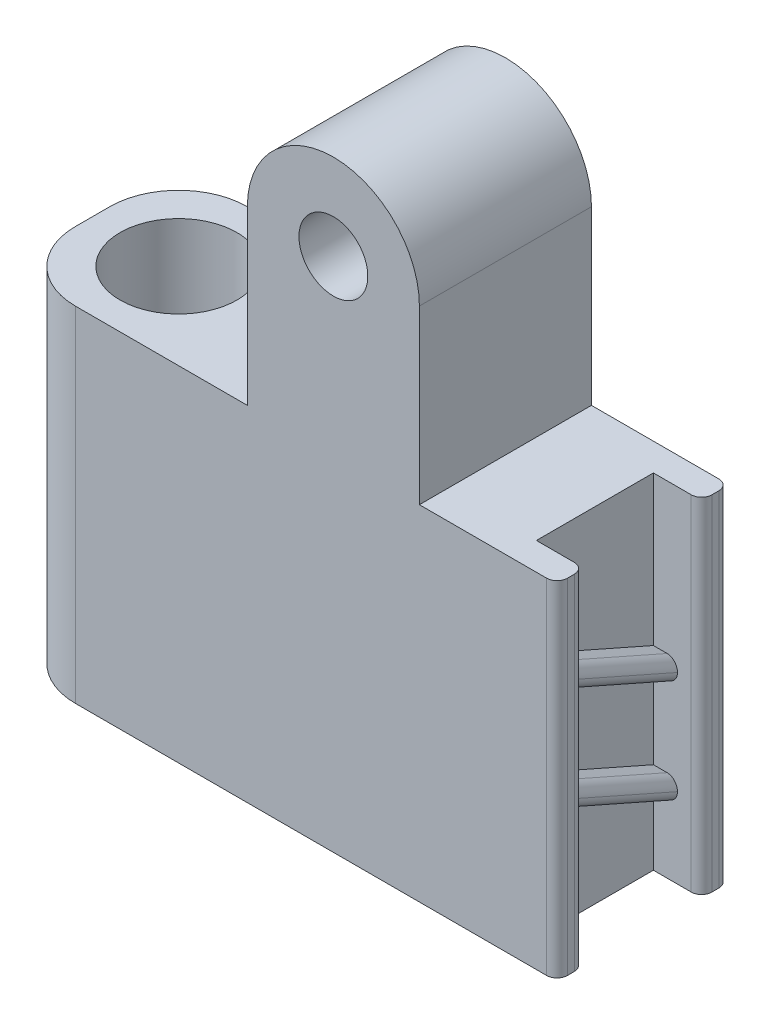
ISO-10303-21;
HEADER;
FILE_DESCRIPTION(('STEP AP214'),'2;1');
FILE_NAME('part.step','',(''),(''),'','','');
FILE_SCHEMA(('AUTOMOTIVE_DESIGN { 1 0 10303 214 1 1 1 1 }'));
ENDSEC;
DATA;
#1=APPLICATION_CONTEXT('core data for automotive mechanical design processes');
#2=APPLICATION_PROTOCOL_DEFINITION('international standard','automotive_design',2000,#1);
#3=PRODUCT_CONTEXT('',#1,'mechanical');
#4=PRODUCT('Part','Part','',(#3));
#5=PRODUCT_RELATED_PRODUCT_CATEGORY('part','',(#4));
#6=PRODUCT_DEFINITION_FORMATION('','',#4);
#7=PRODUCT_DEFINITION_CONTEXT('part definition',#1,'design');
#8=PRODUCT_DEFINITION('design','',#6,#7);
#9=PRODUCT_DEFINITION_SHAPE('','',#8);
#10=(LENGTH_UNIT() NAMED_UNIT(*) SI_UNIT(.MILLI.,.METRE.));
#11=(NAMED_UNIT(*) PLANE_ANGLE_UNIT() SI_UNIT($,.RADIAN.));
#12=(NAMED_UNIT(*) SI_UNIT($,.STERADIAN.) SOLID_ANGLE_UNIT());
#13=UNCERTAINTY_MEASURE_WITH_UNIT(LENGTH_MEASURE(1.E-05),#10,'distance_accuracy_value','');
#14=(GEOMETRIC_REPRESENTATION_CONTEXT(3) GLOBAL_UNCERTAINTY_ASSIGNED_CONTEXT((#13)) GLOBAL_UNIT_ASSIGNED_CONTEXT((#10,
#11,#12)) REPRESENTATION_CONTEXT('',''));
#15=CARTESIAN_POINT('',(0.,0.,0.));
#16=DIRECTION('',(0.,0.,1.));
#17=DIRECTION('',(1.,0.,0.));
#18=AXIS2_PLACEMENT_3D('',#15,#16,#17);
#19=CARTESIAN_POINT('',(0.,10.,0.));
#20=DIRECTION('',(0.,1.,0.));
#21=DIRECTION('',(0.,0.,1.));
#22=AXIS2_PLACEMENT_3D('',#19,#20,#21);
#23=PLANE('',#22);
#24=CARTESIAN_POINT('',(0.,10.,2.5));
#25=DIRECTION('',(0.,1.,0.));
#26=DIRECTION('',(0.,0.,1.));
#27=AXIS2_PLACEMENT_3D('',#24,#25,#26);
#28=CIRCLE('',#27,1.7);
#29=CARTESIAN_POINT('',(0.,10.,4.2));
#30=VERTEX_POINT('',#29);
#31=EDGE_CURVE('E387',#30,#30,#28,.T.);
#32=ORIENTED_EDGE('',*,*,#31,.F.);
#33=EDGE_LOOP('',(#32));
#34=FACE_BOUND('',#33,.T.);
#35=DIRECTION('',(0.,0.,1.));
#36=VECTOR('',#35,1.);
#37=CARTESIAN_POINT('',(-2.5,10.,0.));
#38=LINE('',#37,#36);
#39=CARTESIAN_POINT('',(-2.5,10.,2.));
#40=VERTEX_POINT('',#39);
#41=CARTESIAN_POINT('',(-2.5,10.,3.));
#42=VERTEX_POINT('',#41);
#43=EDGE_CURVE('E334',#40,#42,#38,.T.);
#44=ORIENTED_EDGE('',*,*,#43,.T.);
#45=CARTESIAN_POINT('',(-0.5,10.,3.));
#46=DIRECTION('',(0.,1.,0.));
#47=DIRECTION('',(0.,0.,1.));
#48=AXIS2_PLACEMENT_3D('',#45,#46,#47);
#49=CIRCLE('',#48,2.);
#50=CARTESIAN_POINT('',(-0.5,10.,5.));
#51=VERTEX_POINT('',#50);
#52=EDGE_CURVE('E362',#42,#51,#49,.T.);
#53=ORIENTED_EDGE('',*,*,#52,.T.);
#54=DIRECTION('',(1.,0.,0.));
#55=VECTOR('',#54,1.);
#56=CARTESIAN_POINT('',(-2.5,10.,5.));
#57=LINE('',#56,#55);
#58=CARTESIAN_POINT('',(4.5,10.,5.));
#59=VERTEX_POINT('',#58);
#60=EDGE_CURVE('E333',#51,#59,#57,.T.);
#61=ORIENTED_EDGE('',*,*,#60,.T.);
#62=DIRECTION('',(0.,0.,-1.));
#63=VECTOR('',#62,1.);
#64=CARTESIAN_POINT('',(4.5,10.,14.01387818866));
#65=LINE('',#64,#63);
#66=CARTESIAN_POINT('',(4.5,10.,0.));
#67=VERTEX_POINT('',#66);
#68=EDGE_CURVE('E378',#59,#67,#65,.T.);
#69=ORIENTED_EDGE('',*,*,#68,.T.);
#70=DIRECTION('',(-1.,0.,0.));
#71=VECTOR('',#70,1.);
#72=CARTESIAN_POINT('',(0.,10.,0.));
#73=LINE('',#72,#71);
#74=CARTESIAN_POINT('',(-0.5,10.,0.));
#75=VERTEX_POINT('',#74);
#76=EDGE_CURVE('E256',#67,#75,#73,.T.);
#77=ORIENTED_EDGE('',*,*,#76,.T.);
#78=CARTESIAN_POINT('',(-0.5,10.,2.));
#79=DIRECTION('',(0.,1.,0.));
#80=DIRECTION('',(0.,0.,1.));
#81=AXIS2_PLACEMENT_3D('',#78,#79,#80);
#82=CIRCLE('',#81,2.);
#83=EDGE_CURVE('E360',#75,#40,#82,.T.);
#84=ORIENTED_EDGE('',*,*,#83,.T.);
#85=EDGE_LOOP('',(#44,#53,#61,#69,#77,#84));
#86=FACE_BOUND('',#85,.T.);
#87=ADVANCED_FACE('F33',(#34,#86),#23,.T.);
#88=CARTESIAN_POINT('',(11.5,10.,4.2));
#89=DIRECTION('',(0.,0.,1.));
#90=DIRECTION('',(1.,0.,0.));
#91=AXIS2_PLACEMENT_3D('',#88,#89,#90);
#92=PLANE('',#91);
#93=DIRECTION('',(-1.,0.,0.));
#94=VECTOR('',#93,1.);
#95=CARTESIAN_POINT('',(11.5,0.,4.2));
#96=LINE('',#95,#94);
#97=CARTESIAN_POINT('',(13.2,0.,4.2));
#98=VERTEX_POINT('',#97);
#99=CARTESIAN_POINT('',(12.1,0.,4.2));
#100=VERTEX_POINT('',#99);
#101=EDGE_CURVE('E232',#98,#100,#96,.T.);
#102=ORIENTED_EDGE('',*,*,#101,.T.);
#103=DIRECTION('',(0.,-1.,0.));
#104=VECTOR('',#103,1.);
#105=CARTESIAN_POINT('',(12.1,10.,4.2));
#106=LINE('',#105,#104);
#107=CARTESIAN_POINT('',(12.1,3.5,4.2));
#108=VERTEX_POINT('',#107);
#109=EDGE_CURVE('E216',#108,#100,#106,.T.);
#110=ORIENTED_EDGE('',*,*,#109,.F.);
#111=DIRECTION('',(-1.,0.,0.));
#112=VECTOR('',#111,1.);
#113=CARTESIAN_POINT('',(12.8,3.5,4.2));
#114=LINE('',#113,#112);
#115=CARTESIAN_POINT('',(12.5,3.5,4.2));
#116=VERTEX_POINT('',#115);
#117=EDGE_CURVE('E474',#116,#108,#114,.T.);
#118=ORIENTED_EDGE('',*,*,#117,.F.);
#119=CARTESIAN_POINT('',(12.5,3.82789830898933,4.2));
#120=DIRECTION('',(0.,0.,1.));
#121=DIRECTION('',(0.,-1.,0.));
#122=AXIS2_PLACEMENT_3D('',#119,#120,#121);
#123=ELLIPSE('',#122,0.32789830898933,0.3);
#124=CARTESIAN_POINT('',(12.8,3.82789830898933,4.2));
#125=VERTEX_POINT('',#124);
#126=EDGE_CURVE('E282',#116,#125,#123,.T.);
#127=ORIENTED_EDGE('',*,*,#126,.T.);
#128=CARTESIAN_POINT('',(12.5,3.82789830898933,4.2));
#129=DIRECTION('',(0.,0.,1.));
#130=DIRECTION('',(0.,1.,0.));
#131=AXIS2_PLACEMENT_3D('',#128,#129,#130);
#132=ELLIPSE('',#131,0.32789830898933,0.3);
#133=CARTESIAN_POINT('',(12.5,4.15579661797866,4.2));
#134=VERTEX_POINT('',#133);
#135=EDGE_CURVE('E276',#125,#134,#132,.T.);
#136=ORIENTED_EDGE('',*,*,#135,.T.);
#137=DIRECTION('',(-1.,0.,0.));
#138=VECTOR('',#137,1.);
#139=CARTESIAN_POINT('',(12.8,4.15579661797866,4.2));
#140=LINE('',#139,#138);
#141=CARTESIAN_POINT('',(12.1,4.15579661797866,4.2));
#142=VERTEX_POINT('',#141);
#143=EDGE_CURVE('E288',#134,#142,#140,.T.);
#144=ORIENTED_EDGE('',*,*,#143,.T.);
#145=CARTESIAN_POINT('',(12.1,6.5,4.2));
#146=VERTEX_POINT('',#145);
#147=EDGE_CURVE('E225',#146,#142,#106,.T.);
#148=ORIENTED_EDGE('',*,*,#147,.F.);
#149=DIRECTION('',(-1.,0.,0.));
#150=VECTOR('',#149,1.);
#151=CARTESIAN_POINT('',(12.8,6.5,4.2));
#152=LINE('',#151,#150);
#153=CARTESIAN_POINT('',(12.5,6.5,4.2));
#154=VERTEX_POINT('',#153);
#155=EDGE_CURVE('E472',#154,#146,#152,.T.);
#156=ORIENTED_EDGE('',*,*,#155,.F.);
#157=CARTESIAN_POINT('',(12.5,6.82789830898933,4.2));
#158=DIRECTION('',(0.,0.,1.));
#159=DIRECTION('',(0.,-1.,0.));
#160=AXIS2_PLACEMENT_3D('',#157,#158,#159);
#161=ELLIPSE('',#160,0.32789830898933,0.3);
#162=CARTESIAN_POINT('',(12.8,6.82789830898933,4.2));
#163=VERTEX_POINT('',#162);
#164=EDGE_CURVE('E274',#154,#163,#161,.T.);
#165=ORIENTED_EDGE('',*,*,#164,.T.);
#166=CARTESIAN_POINT('',(12.5,6.82789830898933,4.2));
#167=DIRECTION('',(0.,0.,1.));
#168=DIRECTION('',(0.,1.,0.));
#169=AXIS2_PLACEMENT_3D('',#166,#167,#168);
#170=ELLIPSE('',#169,0.32789830898933,0.3);
#171=CARTESIAN_POINT('',(12.5,7.15579661797866,4.2));
#172=VERTEX_POINT('',#171);
#173=EDGE_CURVE('E268',#163,#172,#170,.T.);
#174=ORIENTED_EDGE('',*,*,#173,.T.);
#175=DIRECTION('',(-1.,0.,0.));
#176=VECTOR('',#175,1.);
#177=CARTESIAN_POINT('',(12.8,7.15579661797866,4.2));
#178=LINE('',#177,#176);
#179=CARTESIAN_POINT('',(12.1,7.15579661797866,4.2));
#180=VERTEX_POINT('',#179);
#181=EDGE_CURVE('E469',#172,#180,#178,.T.);
#182=ORIENTED_EDGE('',*,*,#181,.T.);
#183=CARTESIAN_POINT('',(12.1,10.,4.2));
#184=VERTEX_POINT('',#183);
#185=EDGE_CURVE('E48',#184,#180,#106,.T.);
#186=ORIENTED_EDGE('',*,*,#185,.F.);
#187=DIRECTION('',(-1.,0.,0.));
#188=VECTOR('',#187,1.);
#189=CARTESIAN_POINT('',(11.5,10.,4.2));
#190=LINE('',#189,#188);
#191=CARTESIAN_POINT('',(13.2,10.,4.2));
#192=VERTEX_POINT('',#191);
#193=EDGE_CURVE('E396',#192,#184,#190,.T.);
#194=ORIENTED_EDGE('',*,*,#193,.F.);
#195=DIRECTION('',(0.,-1.,0.));
#196=VECTOR('',#195,1.);
#197=CARTESIAN_POINT('',(13.2,10.,4.2));
#198=LINE('',#197,#196);
#199=EDGE_CURVE('E241',#192,#98,#198,.T.);
#200=ORIENTED_EDGE('',*,*,#199,.T.);
#201=EDGE_LOOP('',(#102,#110,#118,#127,#136,#144,#148,#156,#165,#174,#182,#186,#194,#200));
#202=FACE_BOUND('',#201,.T.);
#203=ADVANCED_FACE('F238',(#202),#92,.F.);
#204=CARTESIAN_POINT('',(13.5,10.,0.8));
#205=DIRECTION('',(0.,0.,-1.));
#206=DIRECTION('',(-1.,0.,0.));
#207=AXIS2_PLACEMENT_3D('',#204,#205,#206);
#208=PLANE('',#207);
#209=DIRECTION('',(1.,0.,0.));
#210=VECTOR('',#209,1.);
#211=CARTESIAN_POINT('',(13.5,10.,0.8));
#212=LINE('',#211,#210);
#213=CARTESIAN_POINT('',(12.1,10.,0.8));
#214=VERTEX_POINT('',#213);
#215=CARTESIAN_POINT('',(13.2,10.,0.8));
#216=VERTEX_POINT('',#215);
#217=EDGE_CURVE('E395',#214,#216,#212,.T.);
#218=ORIENTED_EDGE('',*,*,#217,.F.);
#219=DIRECTION('',(0.,1.,0.));
#220=VECTOR('',#219,1.);
#221=CARTESIAN_POINT('',(12.1,10.,0.8));
#222=LINE('',#221,#220);
#223=CARTESIAN_POINT('',(12.1,5.65579661797866,0.8));
#224=VERTEX_POINT('',#223);
#225=EDGE_CURVE('E235',#224,#214,#222,.T.);
#226=ORIENTED_EDGE('',*,*,#225,.F.);
#227=DIRECTION('',(-1.,0.,0.));
#228=VECTOR('',#227,1.);
#229=CARTESIAN_POINT('',(12.8,5.65579661797866,0.8));
#230=LINE('',#229,#228);
#231=CARTESIAN_POINT('',(12.5,5.65579661797866,0.8));
#232=VERTEX_POINT('',#231);
#233=EDGE_CURVE('E462',#232,#224,#230,.T.);
#234=ORIENTED_EDGE('',*,*,#233,.F.);
#235=CARTESIAN_POINT('',(12.5,5.32789830898933,0.8));
#236=DIRECTION('',(0.,0.,-1.));
#237=DIRECTION('',(0.,1.,0.));
#238=AXIS2_PLACEMENT_3D('',#235,#236,#237);
#239=ELLIPSE('',#238,0.32789830898933,0.3);
#240=CARTESIAN_POINT('',(12.8,5.32789830898933,0.8));
#241=VERTEX_POINT('',#240);
#242=EDGE_CURVE('E270',#232,#241,#239,.T.);
#243=ORIENTED_EDGE('',*,*,#242,.T.);
#244=CARTESIAN_POINT('',(12.5,5.32789830898933,0.8));
#245=DIRECTION('',(0.,0.,-1.));
#246=DIRECTION('',(0.,-1.,0.));
#247=AXIS2_PLACEMENT_3D('',#244,#245,#246);
#248=ELLIPSE('',#247,0.32789830898933,0.3);
#249=CARTESIAN_POINT('',(12.5,5.,0.8));
#250=VERTEX_POINT('',#249);
#251=EDGE_CURVE('E272',#241,#250,#248,.T.);
#252=ORIENTED_EDGE('',*,*,#251,.T.);
#253=DIRECTION('',(-1.,0.,0.));
#254=VECTOR('',#253,1.);
#255=CARTESIAN_POINT('',(12.8,5.,0.8));
#256=LINE('',#255,#254);
#257=CARTESIAN_POINT('',(12.1,5.,0.8));
#258=VERTEX_POINT('',#257);
#259=EDGE_CURVE('E468',#250,#258,#256,.T.);
#260=ORIENTED_EDGE('',*,*,#259,.T.);
#261=CARTESIAN_POINT('',(12.1,2.65579661797866,0.8));
#262=VERTEX_POINT('',#261);
#263=EDGE_CURVE('E455',#262,#258,#222,.T.);
#264=ORIENTED_EDGE('',*,*,#263,.F.);
#265=DIRECTION('',(-1.,0.,0.));
#266=VECTOR('',#265,1.);
#267=CARTESIAN_POINT('',(12.8,2.65579661797866,0.8));
#268=LINE('',#267,#266);
#269=CARTESIAN_POINT('',(12.5,2.65579661797866,0.8));
#270=VERTEX_POINT('',#269);
#271=EDGE_CURVE('E507',#270,#262,#268,.T.);
#272=ORIENTED_EDGE('',*,*,#271,.F.);
#273=CARTESIAN_POINT('',(12.5,2.32789830898933,0.8));
#274=DIRECTION('',(0.,0.,-1.));
#275=DIRECTION('',(0.,1.,0.));
#276=AXIS2_PLACEMENT_3D('',#273,#274,#275);
#277=ELLIPSE('',#276,0.32789830898933,0.3);
#278=CARTESIAN_POINT('',(12.8,2.32789830898933,0.8));
#279=VERTEX_POINT('',#278);
#280=EDGE_CURVE('E278',#270,#279,#277,.T.);
#281=ORIENTED_EDGE('',*,*,#280,.T.);
#282=CARTESIAN_POINT('',(12.5,2.32789830898933,0.8));
#283=DIRECTION('',(0.,0.,-1.));
#284=DIRECTION('',(0.,-1.,0.));
#285=AXIS2_PLACEMENT_3D('',#282,#283,#284);
#286=ELLIPSE('',#285,0.32789830898933,0.3);
#287=CARTESIAN_POINT('',(12.5,2.,0.8));
#288=VERTEX_POINT('',#287);
#289=EDGE_CURVE('E280',#279,#288,#286,.T.);
#290=ORIENTED_EDGE('',*,*,#289,.T.);
#291=DIRECTION('',(-1.,0.,0.));
#292=VECTOR('',#291,1.);
#293=CARTESIAN_POINT('',(12.8,2.,0.8));
#294=LINE('',#293,#292);
#295=CARTESIAN_POINT('',(12.1,2.,0.8));
#296=VERTEX_POINT('',#295);
#297=EDGE_CURVE('E453',#288,#296,#294,.T.);
#298=ORIENTED_EDGE('',*,*,#297,.T.);
#299=CARTESIAN_POINT('',(12.1,0.,0.8));
#300=VERTEX_POINT('',#299);
#301=EDGE_CURVE('E56',#300,#296,#222,.T.);
#302=ORIENTED_EDGE('',*,*,#301,.F.);
#303=DIRECTION('',(1.,0.,0.));
#304=VECTOR('',#303,1.);
#305=CARTESIAN_POINT('',(13.5,0.,0.8));
#306=LINE('',#305,#304);
#307=CARTESIAN_POINT('',(13.2,0.,0.8));
#308=VERTEX_POINT('',#307);
#309=EDGE_CURVE('E234',#300,#308,#306,.T.);
#310=ORIENTED_EDGE('',*,*,#309,.T.);
#311=DIRECTION('',(0.,-1.,0.));
#312=VECTOR('',#311,1.);
#313=CARTESIAN_POINT('',(13.2,10.,0.8));
#314=LINE('',#313,#312);
#315=EDGE_CURVE('E325',#308,#216,#314,.F.);
#316=ORIENTED_EDGE('',*,*,#315,.T.);
#317=EDGE_LOOP('',(#218,#226,#234,#243,#252,#260,#264,#272,#281,#290,#298,#302,#310,#316));
#318=FACE_BOUND('',#317,.T.);
#319=ADVANCED_FACE('F449',(#318),#208,.F.);
#320=DIRECTION('',(0.,0.,1.));
#321=VECTOR('',#320,1.);
#322=CARTESIAN_POINT('',(12.1,10.,4.2));
#323=LINE('',#322,#321);
#324=EDGE_CURVE('E454',#214,#184,#323,.T.);
#325=ORIENTED_EDGE('',*,*,#324,.F.);
#326=ORIENTED_EDGE('',*,*,#217,.T.);
#327=CARTESIAN_POINT('',(13.2,10.,0.5));
#328=DIRECTION('',(0.,1.,0.));
#329=DIRECTION('',(0.,0.,1.));
#330=AXIS2_PLACEMENT_3D('',#327,#328,#329);
#331=CIRCLE('',#330,0.3);
#332=CARTESIAN_POINT('',(13.5,10.,0.5));
#333=VERTEX_POINT('',#332);
#334=EDGE_CURVE('E311',#216,#333,#331,.T.);
#335=ORIENTED_EDGE('',*,*,#334,.T.);
#336=DIRECTION('',(0.,0.,-1.));
#337=VECTOR('',#336,1.);
#338=CARTESIAN_POINT('',(13.5,10.,0.));
#339=LINE('',#338,#337);
#340=CARTESIAN_POINT('',(13.5,10.,0.3));
#341=VERTEX_POINT('',#340);
#342=EDGE_CURVE('E261',#333,#341,#339,.T.);
#343=ORIENTED_EDGE('',*,*,#342,.T.);
#344=CARTESIAN_POINT('',(13.2,10.,0.3));
#345=DIRECTION('',(0.,1.,0.));
#346=DIRECTION('',(0.,0.,1.));
#347=AXIS2_PLACEMENT_3D('',#344,#345,#346);
#348=CIRCLE('',#347,0.3);
#349=CARTESIAN_POINT('',(13.2,10.,0.));
#350=VERTEX_POINT('',#349);
#351=EDGE_CURVE('E313',#341,#350,#348,.T.);
#352=ORIENTED_EDGE('',*,*,#351,.T.);
#353=CARTESIAN_POINT('',(9.5,10.,0.));
#354=VERTEX_POINT('',#353);
#355=EDGE_CURVE('E335',#350,#354,#73,.T.);
#356=ORIENTED_EDGE('',*,*,#355,.T.);
#357=DIRECTION('',(0.,0.,-1.));
#358=VECTOR('',#357,1.);
#359=CARTESIAN_POINT('',(9.5,10.,14.01387818866));
#360=LINE('',#359,#358);
#361=CARTESIAN_POINT('',(9.5,10.,5.));
#362=VERTEX_POINT('',#361);
#363=EDGE_CURVE('E428',#362,#354,#360,.T.);
#364=ORIENTED_EDGE('',*,*,#363,.F.);
#365=CARTESIAN_POINT('',(13.2,10.,5.));
#366=VERTEX_POINT('',#365);
#367=EDGE_CURVE('E330',#362,#366,#57,.T.);
#368=ORIENTED_EDGE('',*,*,#367,.T.);
#369=CARTESIAN_POINT('',(13.2,10.,4.7));
#370=DIRECTION('',(0.,1.,0.));
#371=DIRECTION('',(0.,0.,1.));
#372=AXIS2_PLACEMENT_3D('',#369,#370,#371);
#373=CIRCLE('',#372,0.3);
#374=CARTESIAN_POINT('',(13.5,10.,4.7));
#375=VERTEX_POINT('',#374);
#376=EDGE_CURVE('E315',#366,#375,#373,.T.);
#377=ORIENTED_EDGE('',*,*,#376,.T.);
#378=DIRECTION('',(0.,0.,-1.));
#379=VECTOR('',#378,1.);
#380=CARTESIAN_POINT('',(13.5,10.,4.2));
#381=LINE('',#380,#379);
#382=CARTESIAN_POINT('',(13.5,10.,4.5));
#383=VERTEX_POINT('',#382);
#384=EDGE_CURVE('E341',#375,#383,#381,.T.);
#385=ORIENTED_EDGE('',*,*,#384,.T.);
#386=CARTESIAN_POINT('',(13.2,10.,4.5));
#387=DIRECTION('',(0.,1.,0.));
#388=DIRECTION('',(0.,0.,1.));
#389=AXIS2_PLACEMENT_3D('',#386,#387,#388);
#390=CIRCLE('',#389,0.3);
#391=EDGE_CURVE('E309',#383,#192,#390,.T.);
#392=ORIENTED_EDGE('',*,*,#391,.T.);
#393=ORIENTED_EDGE('',*,*,#193,.T.);
#394=EDGE_LOOP('',(#325,#326,#335,#343,#352,#356,#364,#368,#377,#385,#392,#393));
#395=FACE_BOUND('',#394,.T.);
#396=ADVANCED_FACE('F403',(#395),#23,.T.);
#397=CARTESIAN_POINT('',(0.,0.,0.));
#398=DIRECTION('',(0.,1.,0.));
#399=DIRECTION('',(0.,0.,1.));
#400=AXIS2_PLACEMENT_3D('',#397,#398,#399);
#401=PLANE('',#400);
#402=ORIENTED_EDGE('',*,*,#309,.F.);
#403=DIRECTION('',(0.,0.,-1.));
#404=VECTOR('',#403,1.);
#405=CARTESIAN_POINT('',(12.1,0.,4.2));
#406=LINE('',#405,#404);
#407=EDGE_CURVE('E219',#100,#300,#406,.T.);
#408=ORIENTED_EDGE('',*,*,#407,.F.);
#409=ORIENTED_EDGE('',*,*,#101,.F.);
#410=CARTESIAN_POINT('',(13.2,0.,4.5));
#411=DIRECTION('',(0.,1.,0.));
#412=DIRECTION('',(0.,0.,1.));
#413=AXIS2_PLACEMENT_3D('',#410,#411,#412);
#414=CIRCLE('',#413,0.3);
#415=CARTESIAN_POINT('',(13.5,0.,4.5));
#416=VERTEX_POINT('',#415);
#417=EDGE_CURVE('E297',#98,#416,#414,.F.);
#418=ORIENTED_EDGE('',*,*,#417,.T.);
#419=DIRECTION('',(0.,0.,-1.));
#420=VECTOR('',#419,1.);
#421=CARTESIAN_POINT('',(13.5,0.,4.2));
#422=LINE('',#421,#420);
#423=CARTESIAN_POINT('',(13.5,0.,4.7));
#424=VERTEX_POINT('',#423);
#425=EDGE_CURVE('E242',#424,#416,#422,.T.);
#426=ORIENTED_EDGE('',*,*,#425,.F.);
#427=CARTESIAN_POINT('',(13.2,0.,4.7));
#428=DIRECTION('',(0.,1.,0.));
#429=DIRECTION('',(0.,0.,1.));
#430=AXIS2_PLACEMENT_3D('',#427,#428,#429);
#431=CIRCLE('',#430,0.3);
#432=CARTESIAN_POINT('',(13.2,0.,5.));
#433=VERTEX_POINT('',#432);
#434=EDGE_CURVE('E303',#424,#433,#431,.F.);
#435=ORIENTED_EDGE('',*,*,#434,.T.);
#436=DIRECTION('',(1.,0.,0.));
#437=VECTOR('',#436,1.);
#438=CARTESIAN_POINT('',(0.,0.,5.));
#439=LINE('',#438,#437);
#440=CARTESIAN_POINT('',(-0.5,0.,5.));
#441=VERTEX_POINT('',#440);
#442=EDGE_CURVE('E247',#441,#433,#439,.T.);
#443=ORIENTED_EDGE('',*,*,#442,.F.);
#444=CARTESIAN_POINT('',(-0.5,0.,3.));
#445=DIRECTION('',(0.,1.,0.));
#446=DIRECTION('',(0.,0.,1.));
#447=AXIS2_PLACEMENT_3D('',#444,#445,#446);
#448=CIRCLE('',#447,2.);
#449=CARTESIAN_POINT('',(-2.5,0.,3.));
#450=VERTEX_POINT('',#449);
#451=EDGE_CURVE('E353',#441,#450,#448,.F.);
#452=ORIENTED_EDGE('',*,*,#451,.T.);
#453=DIRECTION('',(0.,0.,1.));
#454=VECTOR('',#453,1.);
#455=CARTESIAN_POINT('',(-2.5,0.,0.));
#456=LINE('',#455,#454);
#457=CARTESIAN_POINT('',(-2.5,0.,2.));
#458=VERTEX_POINT('',#457);
#459=EDGE_CURVE('E384',#458,#450,#456,.T.);
#460=ORIENTED_EDGE('',*,*,#459,.F.);
#461=CARTESIAN_POINT('',(-0.5,0.,2.));
#462=DIRECTION('',(0.,1.,0.));
#463=DIRECTION('',(0.,0.,1.));
#464=AXIS2_PLACEMENT_3D('',#461,#462,#463);
#465=CIRCLE('',#464,2.);
#466=CARTESIAN_POINT('',(-0.5,0.,0.));
#467=VERTEX_POINT('',#466);
#468=EDGE_CURVE('E351',#458,#467,#465,.F.);
#469=ORIENTED_EDGE('',*,*,#468,.T.);
#470=DIRECTION('',(-1.,0.,0.));
#471=VECTOR('',#470,1.);
#472=CARTESIAN_POINT('',(0.,0.,0.));
#473=LINE('',#472,#471);
#474=CARTESIAN_POINT('',(13.2,0.,0.));
#475=VERTEX_POINT('',#474);
#476=EDGE_CURVE('E253',#475,#467,#473,.T.);
#477=ORIENTED_EDGE('',*,*,#476,.F.);
#478=CARTESIAN_POINT('',(13.2,0.,0.3));
#479=DIRECTION('',(0.,1.,0.));
#480=DIRECTION('',(0.,0.,1.));
#481=AXIS2_PLACEMENT_3D('',#478,#479,#480);
#482=CIRCLE('',#481,0.3);
#483=CARTESIAN_POINT('',(13.5,0.,0.3));
#484=VERTEX_POINT('',#483);
#485=EDGE_CURVE('E301',#475,#484,#482,.F.);
#486=ORIENTED_EDGE('',*,*,#485,.T.);
#487=DIRECTION('',(0.,0.,-1.));
#488=VECTOR('',#487,1.);
#489=CARTESIAN_POINT('',(13.5,0.,0.));
#490=LINE('',#489,#488);
#491=CARTESIAN_POINT('',(13.5,0.,0.5));
#492=VERTEX_POINT('',#491);
#493=EDGE_CURVE('E244',#492,#484,#490,.T.);
#494=ORIENTED_EDGE('',*,*,#493,.F.);
#495=CARTESIAN_POINT('',(13.2,0.,0.5));
#496=DIRECTION('',(0.,1.,0.));
#497=DIRECTION('',(0.,0.,1.));
#498=AXIS2_PLACEMENT_3D('',#495,#496,#497);
#499=CIRCLE('',#498,0.3);
#500=EDGE_CURVE('E299',#492,#308,#499,.F.);
#501=ORIENTED_EDGE('',*,*,#500,.T.);
#502=EDGE_LOOP('',(#402,#408,#409,#418,#426,#435,#443,#452,#460,#469,#477,#486,#494,#501));
#503=FACE_BOUND('',#502,.T.);
#504=CARTESIAN_POINT('',(0.,0.,2.5));
#505=DIRECTION('',(0.,1.,0.));
#506=DIRECTION('',(0.,0.,1.));
#507=AXIS2_PLACEMENT_3D('',#504,#505,#506);
#508=CIRCLE('',#507,1.7);
#509=CARTESIAN_POINT('',(0.,0.,4.2));
#510=VERTEX_POINT('',#509);
#511=EDGE_CURVE('E390',#510,#510,#508,.T.);
#512=ORIENTED_EDGE('',*,*,#511,.T.);
#513=EDGE_LOOP('',(#512));
#514=FACE_BOUND('',#513,.T.);
#515=ADVANCED_FACE('F230',(#503,#514),#401,.F.);
#516=CARTESIAN_POINT('',(-2.5,10.,0.));
#517=DIRECTION('',(1.,0.,0.));
#518=DIRECTION('',(0.,0.,-1.));
#519=AXIS2_PLACEMENT_3D('',#516,#517,#518);
#520=PLANE('',#519);
#521=ORIENTED_EDGE('',*,*,#459,.T.);
#522=DIRECTION('',(0.,-1.,0.));
#523=VECTOR('',#522,1.);
#524=CARTESIAN_POINT('',(-2.5,10.,3.));
#525=LINE('',#524,#523);
#526=EDGE_CURVE('E358',#450,#42,#525,.F.);
#527=ORIENTED_EDGE('',*,*,#526,.T.);
#528=ORIENTED_EDGE('',*,*,#43,.F.);
#529=DIRECTION('',(0.,-1.,0.));
#530=VECTOR('',#529,1.);
#531=CARTESIAN_POINT('',(-2.5,10.,2.));
#532=LINE('',#531,#530);
#533=EDGE_CURVE('E355',#40,#458,#532,.T.);
#534=ORIENTED_EDGE('',*,*,#533,.T.);
#535=EDGE_LOOP('',(#521,#527,#528,#534));
#536=FACE_BOUND('',#535,.T.);
#537=ADVANCED_FACE('F383',(#536),#520,.F.);
#538=CARTESIAN_POINT('',(0.,10.,5.));
#539=DIRECTION('',(0.,0.,-1.));
#540=DIRECTION('',(-1.,0.,0.));
#541=AXIS2_PLACEMENT_3D('',#538,#539,#540);
#542=PLANE('',#541);
#543=ORIENTED_EDGE('',*,*,#60,.F.);
#544=DIRECTION('',(0.,-1.,0.));
#545=VECTOR('',#544,1.);
#546=CARTESIAN_POINT('',(-0.5,10.,5.));
#547=LINE('',#546,#545);
#548=EDGE_CURVE('E329',#51,#441,#547,.T.);
#549=ORIENTED_EDGE('',*,*,#548,.T.);
#550=ORIENTED_EDGE('',*,*,#442,.T.);
#551=DIRECTION('',(0.,-1.,0.));
#552=VECTOR('',#551,1.);
#553=CARTESIAN_POINT('',(13.2,10.,5.));
#554=LINE('',#553,#552);
#555=EDGE_CURVE('E306',#433,#366,#554,.F.);
#556=ORIENTED_EDGE('',*,*,#555,.T.);
#557=ORIENTED_EDGE('',*,*,#367,.F.);
#558=DIRECTION('',(0.,-1.,0.));
#559=VECTOR('',#558,1.);
#560=CARTESIAN_POINT('',(9.5,15.,5.));
#561=LINE('',#560,#559);
#562=CARTESIAN_POINT('',(9.5,15.,5.));
#563=VERTEX_POINT('',#562);
#564=EDGE_CURVE('E491',#563,#362,#561,.T.);
#565=ORIENTED_EDGE('',*,*,#564,.F.);
#566=CARTESIAN_POINT('',(7.,15.,5.));
#567=DIRECTION('',(0.,0.,-1.));
#568=DIRECTION('',(-1.,0.,0.));
#569=AXIS2_PLACEMENT_3D('',#566,#567,#568);
#570=CIRCLE('',#569,2.5);
#571=CARTESIAN_POINT('',(4.5,15.,5.));
#572=VERTEX_POINT('',#571);
#573=EDGE_CURVE('E499',#572,#563,#570,.T.);
#574=ORIENTED_EDGE('',*,*,#573,.F.);
#575=DIRECTION('',(0.,1.,0.));
#576=VECTOR('',#575,1.);
#577=CARTESIAN_POINT('',(4.5,10.,5.));
#578=LINE('',#577,#576);
#579=EDGE_CURVE('E493',#59,#572,#578,.T.);
#580=ORIENTED_EDGE('',*,*,#579,.F.);
#581=EDGE_LOOP('',(#543,#549,#550,#556,#557,#565,#574,#580));
#582=FACE_BOUND('',#581,.T.);
#583=CARTESIAN_POINT('',(7.,15.,5.));
#584=DIRECTION('',(0.,0.,-1.));
#585=DIRECTION('',(-1.,0.,0.));
#586=AXIS2_PLACEMENT_3D('',#583,#584,#585);
#587=CIRCLE('',#586,1.);
#588=CARTESIAN_POINT('',(6.,15.,5.));
#589=VERTEX_POINT('',#588);
#590=EDGE_CURVE('E292',#589,#589,#587,.T.);
#591=ORIENTED_EDGE('',*,*,#590,.T.);
#592=EDGE_LOOP('',(#591));
#593=FACE_BOUND('',#592,.T.);
#594=ADVANCED_FACE('F417',(#582,#593),#542,.F.);
#595=CARTESIAN_POINT('',(13.5,10.,4.2));
#596=DIRECTION('',(-1.,0.,0.));
#597=DIRECTION('',(0.,0.,1.));
#598=AXIS2_PLACEMENT_3D('',#595,#596,#597);
#599=PLANE('',#598);
#600=ORIENTED_EDGE('',*,*,#384,.F.);
#601=DIRECTION('',(0.,-1.,0.));
#602=VECTOR('',#601,1.);
#603=CARTESIAN_POINT('',(13.5,10.,4.7));
#604=LINE('',#603,#602);
#605=EDGE_CURVE('E294',#375,#424,#604,.T.);
#606=ORIENTED_EDGE('',*,*,#605,.T.);
#607=ORIENTED_EDGE('',*,*,#425,.T.);
#608=DIRECTION('',(0.,-1.,0.));
#609=VECTOR('',#608,1.);
#610=CARTESIAN_POINT('',(13.5,10.,4.5));
#611=LINE('',#610,#609);
#612=EDGE_CURVE('E284',#416,#383,#611,.F.);
#613=ORIENTED_EDGE('',*,*,#612,.T.);
#614=EDGE_LOOP('',(#600,#606,#607,#613));
#615=FACE_BOUND('',#614,.T.);
#616=ADVANCED_FACE('F411',(#615),#599,.F.);
#617=CARTESIAN_POINT('',(13.5,10.,0.));
#618=DIRECTION('',(-1.,0.,0.));
#619=DIRECTION('',(0.,0.,1.));
#620=AXIS2_PLACEMENT_3D('',#617,#618,#619);
#621=PLANE('',#620);
#622=ORIENTED_EDGE('',*,*,#493,.T.);
#623=DIRECTION('',(0.,-1.,0.));
#624=VECTOR('',#623,1.);
#625=CARTESIAN_POINT('',(13.5,10.,0.3));
#626=LINE('',#625,#624);
#627=EDGE_CURVE('E323',#484,#341,#626,.F.);
#628=ORIENTED_EDGE('',*,*,#627,.T.);
#629=ORIENTED_EDGE('',*,*,#342,.F.);
#630=DIRECTION('',(0.,-1.,0.));
#631=VECTOR('',#630,1.);
#632=CARTESIAN_POINT('',(13.5,10.,0.5));
#633=LINE('',#632,#631);
#634=EDGE_CURVE('E320',#333,#492,#633,.T.);
#635=ORIENTED_EDGE('',*,*,#634,.T.);
#636=EDGE_LOOP('',(#622,#628,#629,#635));
#637=FACE_BOUND('',#636,.T.);
#638=ADVANCED_FACE('F440',(#637),#621,.F.);
#639=CARTESIAN_POINT('',(0.,10.,0.));
#640=DIRECTION('',(0.,0.,1.));
#641=DIRECTION('',(1.,0.,0.));
#642=AXIS2_PLACEMENT_3D('',#639,#640,#641);
#643=PLANE('',#642);
#644=ORIENTED_EDGE('',*,*,#476,.T.);
#645=DIRECTION('',(0.,-1.,0.));
#646=VECTOR('',#645,1.);
#647=CARTESIAN_POINT('',(-0.5,10.,0.));
#648=LINE('',#647,#646);
#649=EDGE_CURVE('E41',#467,#75,#648,.F.);
#650=ORIENTED_EDGE('',*,*,#649,.T.);
#651=ORIENTED_EDGE('',*,*,#76,.F.);
#652=DIRECTION('',(0.,-1.,0.));
#653=VECTOR('',#652,1.);
#654=CARTESIAN_POINT('',(4.5,10.,0.));
#655=LINE('',#654,#653);
#656=CARTESIAN_POINT('',(4.5,15.,0.));
#657=VERTEX_POINT('',#656);
#658=EDGE_CURVE('E484',#657,#67,#655,.T.);
#659=ORIENTED_EDGE('',*,*,#658,.F.);
#660=CARTESIAN_POINT('',(7.,15.,0.));
#661=DIRECTION('',(0.,0.,1.));
#662=DIRECTION('',(1.,0.,0.));
#663=AXIS2_PLACEMENT_3D('',#660,#661,#662);
#664=CIRCLE('',#663,2.5);
#665=CARTESIAN_POINT('',(9.5,15.,0.));
#666=VERTEX_POINT('',#665);
#667=EDGE_CURVE('E834',#666,#657,#664,.T.);
#668=ORIENTED_EDGE('',*,*,#667,.F.);
#669=DIRECTION('',(0.,1.,0.));
#670=VECTOR('',#669,1.);
#671=CARTESIAN_POINT('',(9.5,15.,0.));
#672=LINE('',#671,#670);
#673=EDGE_CURVE('E434',#354,#666,#672,.T.);
#674=ORIENTED_EDGE('',*,*,#673,.F.);
#675=ORIENTED_EDGE('',*,*,#355,.F.);
#676=DIRECTION('',(0.,-1.,0.));
#677=VECTOR('',#676,1.);
#678=CARTESIAN_POINT('',(13.2,10.,0.));
#679=LINE('',#678,#677);
#680=EDGE_CURVE('E317',#350,#475,#679,.T.);
#681=ORIENTED_EDGE('',*,*,#680,.T.);
#682=EDGE_LOOP('',(#644,#650,#651,#659,#668,#674,#675,#681));
#683=FACE_BOUND('',#682,.T.);
#684=CARTESIAN_POINT('',(7.,15.,0.));
#685=DIRECTION('',(0.,0.,1.));
#686=DIRECTION('',(1.,0.,0.));
#687=AXIS2_PLACEMENT_3D('',#684,#685,#686);
#688=CIRCLE('',#687,1.);
#689=CARTESIAN_POINT('',(6.,15.,0.));
#690=VERTEX_POINT('',#689);
#691=EDGE_CURVE('E492',#690,#690,#688,.T.);
#692=ORIENTED_EDGE('',*,*,#691,.T.);
#693=EDGE_LOOP('',(#692));
#694=FACE_BOUND('',#693,.T.);
#695=ADVANCED_FACE('F367',(#683,#694),#643,.F.);
#696=CARTESIAN_POINT('',(0.,10.,2.5));
#697=DIRECTION('',(0.,-1.,0.));
#698=DIRECTION('',(0.,0.,-1.));
#699=AXIS2_PLACEMENT_3D('',#696,#697,#698);
#700=CYLINDRICAL_SURFACE('',#699,1.7);
#701=ORIENTED_EDGE('',*,*,#31,.T.);
#702=EDGE_LOOP('',(#701));
#703=FACE_BOUND('',#702,.T.);
#704=ORIENTED_EDGE('',*,*,#511,.F.);
#705=EDGE_LOOP('',(#704));
#706=FACE_BOUND('',#705,.T.);
#707=ADVANCED_FACE('F604',(#703,#706),#700,.F.);
#708=CARTESIAN_POINT('',(12.8,5.,0.8));
#709=DIRECTION('',(0.,0.914917801572932,-0.403640206576293));
#710=DIRECTION('',(0.,0.403640206576293,0.914917801572932));
#711=AXIS2_PLACEMENT_3D('',#708,#709,#710);
#712=PLANE('',#711);
#713=ORIENTED_EDGE('',*,*,#155,.T.);
#714=DIRECTION('',(0.,-0.403640206576293,-0.914917801572932));
#715=VECTOR('',#714,1.);
#716=CARTESIAN_POINT('',(12.1,5.,0.8));
#717=LINE('',#716,#715);
#718=EDGE_CURVE('E537',#146,#258,#717,.T.);
#719=ORIENTED_EDGE('',*,*,#718,.T.);
#720=ORIENTED_EDGE('',*,*,#259,.F.);
#721=DIRECTION('',(0.,-0.403640206576293,-0.914917801572932));
#722=VECTOR('',#721,1.);
#723=CARTESIAN_POINT('',(12.5,5.,0.8));
#724=LINE('',#723,#722);
#725=EDGE_CURVE('E260',#250,#154,#724,.F.);
#726=ORIENTED_EDGE('',*,*,#725,.T.);
#727=EDGE_LOOP('',(#713,#719,#720,#726));
#728=FACE_BOUND('',#727,.T.);
#729=ADVANCED_FACE('F535',(#728),#712,.F.);
#730=CARTESIAN_POINT('',(12.8,7.15579661797866,4.2));
#731=DIRECTION('',(0.,-0.914917801572932,0.403640206576293));
#732=DIRECTION('',(0.,-0.403640206576293,-0.914917801572932));
#733=AXIS2_PLACEMENT_3D('',#730,#731,#732);
#734=PLANE('',#733);
#735=ORIENTED_EDGE('',*,*,#233,.T.);
#736=DIRECTION('',(0.,0.403640206576293,0.914917801572932));
#737=VECTOR('',#736,1.);
#738=CARTESIAN_POINT('',(12.1,7.15579661797866,4.2));
#739=LINE('',#738,#737);
#740=EDGE_CURVE('E459',#224,#180,#739,.T.);
#741=ORIENTED_EDGE('',*,*,#740,.T.);
#742=ORIENTED_EDGE('',*,*,#181,.F.);
#743=DIRECTION('',(0.,0.403640206576293,0.914917801572932));
#744=VECTOR('',#743,1.);
#745=CARTESIAN_POINT('',(12.5,7.15579661797866,4.2));
#746=LINE('',#745,#744);
#747=EDGE_CURVE('E257',#172,#232,#746,.F.);
#748=ORIENTED_EDGE('',*,*,#747,.T.);
#749=EDGE_LOOP('',(#735,#741,#742,#748));
#750=FACE_BOUND('',#749,.T.);
#751=ADVANCED_FACE('F464',(#750),#734,.F.);
#752=CARTESIAN_POINT('',(12.8,2.,0.8));
#753=DIRECTION('',(0.,0.914917801572932,-0.403640206576294));
#754=DIRECTION('',(0.,0.403640206576294,0.914917801572932));
#755=AXIS2_PLACEMENT_3D('',#752,#753,#754);
#756=PLANE('',#755);
#757=ORIENTED_EDGE('',*,*,#117,.T.);
#758=DIRECTION('',(0.,-0.403640206576294,-0.914917801572932));
#759=VECTOR('',#758,1.);
#760=CARTESIAN_POINT('',(12.1,2.,0.8));
#761=LINE('',#760,#759);
#762=EDGE_CURVE('E220',#108,#296,#761,.T.);
#763=ORIENTED_EDGE('',*,*,#762,.T.);
#764=ORIENTED_EDGE('',*,*,#297,.F.);
#765=DIRECTION('',(0.,-0.403640206576294,-0.914917801572932));
#766=VECTOR('',#765,1.);
#767=CARTESIAN_POINT('',(12.5,2.,0.8));
#768=LINE('',#767,#766);
#769=EDGE_CURVE('E266',#288,#116,#768,.F.);
#770=ORIENTED_EDGE('',*,*,#769,.T.);
#771=EDGE_LOOP('',(#757,#763,#764,#770));
#772=FACE_BOUND('',#771,.T.);
#773=ADVANCED_FACE('F511',(#772),#756,.F.);
#774=CARTESIAN_POINT('',(12.8,4.15579661797866,4.2));
#775=DIRECTION('',(0.,-0.914917801572932,0.403640206576293));
#776=DIRECTION('',(0.,-0.403640206576293,-0.914917801572932));
#777=AXIS2_PLACEMENT_3D('',#774,#775,#776);
#778=PLANE('',#777);
#779=ORIENTED_EDGE('',*,*,#271,.T.);
#780=DIRECTION('',(0.,0.403640206576293,0.914917801572932));
#781=VECTOR('',#780,1.);
#782=CARTESIAN_POINT('',(12.1,4.15579661797866,4.2));
#783=LINE('',#782,#781);
#784=EDGE_CURVE('E11',#262,#142,#783,.T.);
#785=ORIENTED_EDGE('',*,*,#784,.T.);
#786=ORIENTED_EDGE('',*,*,#143,.F.);
#787=DIRECTION('',(0.,0.403640206576293,0.914917801572932));
#788=VECTOR('',#787,1.);
#789=CARTESIAN_POINT('',(12.5,4.15579661797866,4.2));
#790=LINE('',#789,#788);
#791=EDGE_CURVE('E263',#134,#270,#790,.F.);
#792=ORIENTED_EDGE('',*,*,#791,.T.);
#793=EDGE_LOOP('',(#779,#785,#786,#792));
#794=FACE_BOUND('',#793,.T.);
#795=ADVANCED_FACE('F525',(#794),#778,.F.);
#796=CARTESIAN_POINT('',(12.5,4.16441017030534,-1.83723978101706));
#797=DIRECTION('',(0.,-0.403640206576293,-0.914917801572932));
#798=DIRECTION('',(0.,0.914917801572932,-0.403640206576293));
#799=AXIS2_PLACEMENT_3D('',#796,#797,#798);
#800=CYLINDRICAL_SURFACE('',#799,0.3);
#801=ORIENTED_EDGE('',*,*,#725,.F.);
#802=ORIENTED_EDGE('',*,*,#251,.F.);
#803=DIRECTION('',(0.,-0.403640206576293,-0.914917801572932));
#804=VECTOR('',#803,1.);
#805=CARTESIAN_POINT('',(12.8,4.16441017030533,-1.83723978101706));
#806=LINE('',#805,#804);
#807=EDGE_CURVE('E285',#163,#241,#806,.T.);
#808=ORIENTED_EDGE('',*,*,#807,.F.);
#809=ORIENTED_EDGE('',*,*,#164,.F.);
#810=EDGE_LOOP('',(#801,#802,#808,#809));
#811=FACE_BOUND('',#810,.T.);
#812=ADVANCED_FACE('F540',(#811),#800,.T.);
#813=CARTESIAN_POINT('',(12.5,4.16441017030534,-1.83723978101706));
#814=DIRECTION('',(0.,0.403640206576293,0.914917801572932));
#815=DIRECTION('',(0.,-0.914917801572932,0.403640206576293));
#816=AXIS2_PLACEMENT_3D('',#813,#814,#815);
#817=CYLINDRICAL_SURFACE('',#816,0.3);
#818=ORIENTED_EDGE('',*,*,#242,.F.);
#819=ORIENTED_EDGE('',*,*,#747,.F.);
#820=ORIENTED_EDGE('',*,*,#173,.F.);
#821=ORIENTED_EDGE('',*,*,#807,.T.);
#822=EDGE_LOOP('',(#818,#819,#820,#821));
#823=FACE_BOUND('',#822,.T.);
#824=ADVANCED_FACE('F544',(#823),#817,.T.);
#825=CARTESIAN_POINT('',(12.5,1.65318641940019,-0.729346949735379));
#826=DIRECTION('',(0.,-0.403640206576294,-0.914917801572932));
#827=DIRECTION('',(0.,0.914917801572932,-0.403640206576294));
#828=AXIS2_PLACEMENT_3D('',#825,#826,#827);
#829=CYLINDRICAL_SURFACE('',#828,0.3);
#830=ORIENTED_EDGE('',*,*,#769,.F.);
#831=ORIENTED_EDGE('',*,*,#289,.F.);
#832=DIRECTION('',(0.,-0.403640206576294,-0.914917801572932));
#833=VECTOR('',#832,1.);
#834=CARTESIAN_POINT('',(12.8,1.65318641940019,-0.729346949735379));
#835=LINE('',#834,#833);
#836=EDGE_CURVE('E289',#125,#279,#835,.T.);
#837=ORIENTED_EDGE('',*,*,#836,.F.);
#838=ORIENTED_EDGE('',*,*,#126,.F.);
#839=EDGE_LOOP('',(#830,#831,#837,#838));
#840=FACE_BOUND('',#839,.T.);
#841=ADVANCED_FACE('F516',(#840),#829,.T.);
#842=CARTESIAN_POINT('',(12.5,1.65318641940019,-0.729346949735379));
#843=DIRECTION('',(0.,0.403640206576293,0.914917801572932));
#844=DIRECTION('',(0.,-0.914917801572932,0.403640206576293));
#845=AXIS2_PLACEMENT_3D('',#842,#843,#844);
#846=CYLINDRICAL_SURFACE('',#845,0.3);
#847=ORIENTED_EDGE('',*,*,#280,.F.);
#848=ORIENTED_EDGE('',*,*,#791,.F.);
#849=ORIENTED_EDGE('',*,*,#135,.F.);
#850=ORIENTED_EDGE('',*,*,#836,.T.);
#851=EDGE_LOOP('',(#847,#848,#849,#850));
#852=FACE_BOUND('',#851,.T.);
#853=ADVANCED_FACE('F521',(#852),#846,.T.);
#854=CARTESIAN_POINT('',(13.2,10.,4.7));
#855=DIRECTION('',(0.,-1.,0.));
#856=DIRECTION('',(0.,0.,-1.));
#857=AXIS2_PLACEMENT_3D('',#854,#855,#856);
#858=CYLINDRICAL_SURFACE('',#857,0.3);
#859=ORIENTED_EDGE('',*,*,#376,.F.);
#860=ORIENTED_EDGE('',*,*,#555,.F.);
#861=ORIENTED_EDGE('',*,*,#434,.F.);
#862=ORIENTED_EDGE('',*,*,#605,.F.);
#863=EDGE_LOOP('',(#859,#860,#861,#862));
#864=FACE_BOUND('',#863,.T.);
#865=ADVANCED_FACE('F413',(#864),#858,.T.);
#866=CARTESIAN_POINT('',(13.2,10.,0.3));
#867=DIRECTION('',(0.,-1.,0.));
#868=DIRECTION('',(0.,0.,-1.));
#869=AXIS2_PLACEMENT_3D('',#866,#867,#868);
#870=CYLINDRICAL_SURFACE('',#869,0.3);
#871=ORIENTED_EDGE('',*,*,#351,.F.);
#872=ORIENTED_EDGE('',*,*,#627,.F.);
#873=ORIENTED_EDGE('',*,*,#485,.F.);
#874=ORIENTED_EDGE('',*,*,#680,.F.);
#875=EDGE_LOOP('',(#871,#872,#873,#874));
#876=FACE_BOUND('',#875,.T.);
#877=ADVANCED_FACE('F436',(#876),#870,.T.);
#878=CARTESIAN_POINT('',(13.2,10.,0.5));
#879=DIRECTION('',(0.,-1.,0.));
#880=DIRECTION('',(0.,0.,-1.));
#881=AXIS2_PLACEMENT_3D('',#878,#879,#880);
#882=CYLINDRICAL_SURFACE('',#881,0.3);
#883=ORIENTED_EDGE('',*,*,#334,.F.);
#884=ORIENTED_EDGE('',*,*,#315,.F.);
#885=ORIENTED_EDGE('',*,*,#500,.F.);
#886=ORIENTED_EDGE('',*,*,#634,.F.);
#887=EDGE_LOOP('',(#883,#884,#885,#886));
#888=FACE_BOUND('',#887,.T.);
#889=ADVANCED_FACE('F445',(#888),#882,.T.);
#890=CARTESIAN_POINT('',(13.2,10.,4.5));
#891=DIRECTION('',(0.,-1.,0.));
#892=DIRECTION('',(0.,0.,-1.));
#893=AXIS2_PLACEMENT_3D('',#890,#891,#892);
#894=CYLINDRICAL_SURFACE('',#893,0.3);
#895=ORIENTED_EDGE('',*,*,#391,.F.);
#896=ORIENTED_EDGE('',*,*,#612,.F.);
#897=ORIENTED_EDGE('',*,*,#417,.F.);
#898=ORIENTED_EDGE('',*,*,#199,.F.);
#899=EDGE_LOOP('',(#895,#896,#897,#898));
#900=FACE_BOUND('',#899,.T.);
#901=ADVANCED_FACE('F409',(#900),#894,.T.);
#902=CARTESIAN_POINT('',(9.5,15.,14.01387818866));
#903=DIRECTION('',(-1.,0.,0.));
#904=DIRECTION('',(0.,-1.,0.));
#905=AXIS2_PLACEMENT_3D('',#902,#903,#904);
#906=PLANE('',#905);
#907=DIRECTION('',(0.,0.,-1.));
#908=VECTOR('',#907,1.);
#909=CARTESIAN_POINT('',(9.5,15.,14.01387818866));
#910=LINE('',#909,#908);
#911=EDGE_CURVE('E502',#563,#666,#910,.T.);
#912=ORIENTED_EDGE('',*,*,#911,.F.);
#913=ORIENTED_EDGE('',*,*,#564,.T.);
#914=ORIENTED_EDGE('',*,*,#363,.T.);
#915=ORIENTED_EDGE('',*,*,#673,.T.);
#916=EDGE_LOOP('',(#912,#913,#914,#915));
#917=FACE_BOUND('',#916,.T.);
#918=ADVANCED_FACE('F682',(#917),#906,.F.);
#919=CARTESIAN_POINT('',(7.,15.,14.01387818866));
#920=DIRECTION('',(0.,0.,-1.));
#921=DIRECTION('',(-1.,0.,0.));
#922=AXIS2_PLACEMENT_3D('',#919,#920,#921);
#923=CYLINDRICAL_SURFACE('',#922,2.5);
#924=DIRECTION('',(0.,0.,-1.));
#925=VECTOR('',#924,1.);
#926=CARTESIAN_POINT('',(4.5,15.,14.01387818866));
#927=LINE('',#926,#925);
#928=EDGE_CURVE('E486',#572,#657,#927,.T.);
#929=ORIENTED_EDGE('',*,*,#928,.F.);
#930=ORIENTED_EDGE('',*,*,#573,.T.);
#931=ORIENTED_EDGE('',*,*,#911,.T.);
#932=ORIENTED_EDGE('',*,*,#667,.T.);
#933=EDGE_LOOP('',(#929,#930,#931,#932));
#934=FACE_BOUND('',#933,.T.);
#935=ADVANCED_FACE('F689',(#934),#923,.T.);
#936=CARTESIAN_POINT('',(4.5,10.,14.01387818866));
#937=DIRECTION('',(1.,0.,0.));
#938=DIRECTION('',(0.,0.,-1.));
#939=AXIS2_PLACEMENT_3D('',#936,#937,#938);
#940=PLANE('',#939);
#941=ORIENTED_EDGE('',*,*,#68,.F.);
#942=ORIENTED_EDGE('',*,*,#579,.T.);
#943=ORIENTED_EDGE('',*,*,#928,.T.);
#944=ORIENTED_EDGE('',*,*,#658,.T.);
#945=EDGE_LOOP('',(#941,#942,#943,#944));
#946=FACE_BOUND('',#945,.T.);
#947=ADVANCED_FACE('F697',(#946),#940,.F.);
#948=CARTESIAN_POINT('',(7.,15.,14.01387818866));
#949=DIRECTION('',(0.,0.,-1.));
#950=DIRECTION('',(-1.,0.,0.));
#951=AXIS2_PLACEMENT_3D('',#948,#949,#950);
#952=CYLINDRICAL_SURFACE('',#951,1.);
#953=CARTESIAN_POINT('',(6.,15.,5.));
#954=CARTESIAN_POINT('',(6.,15.,4.94791666666667));
#955=CARTESIAN_POINT('',(6.,15.,4.89583333333333));
#956=CARTESIAN_POINT('',(6.,15.,4.79166666666667));
#957=CARTESIAN_POINT('',(6.,15.,4.73958333333333));
#958=CARTESIAN_POINT('',(6.,15.,4.63541666666667));
#959=CARTESIAN_POINT('',(6.,15.,4.58333333333333));
#960=CARTESIAN_POINT('',(6.,15.,4.47916666666667));
#961=CARTESIAN_POINT('',(6.,15.,4.42708333333333));
#962=CARTESIAN_POINT('',(6.,15.,4.32291666666667));
#963=CARTESIAN_POINT('',(6.,15.,4.27083333333333));
#964=CARTESIAN_POINT('',(6.,15.,4.16666666666667));
#965=CARTESIAN_POINT('',(6.,15.,4.11458333333333));
#966=CARTESIAN_POINT('',(6.,15.,4.01041666666667));
#967=CARTESIAN_POINT('',(6.,15.,3.95833333333333));
#968=CARTESIAN_POINT('',(6.,15.,3.85416666666667));
#969=CARTESIAN_POINT('',(6.,15.,3.80208333333333));
#970=CARTESIAN_POINT('',(6.,15.,3.69791666666667));
#971=CARTESIAN_POINT('',(6.,15.,3.64583333333333));
#972=CARTESIAN_POINT('',(6.,15.,3.54166666666667));
#973=CARTESIAN_POINT('',(6.,15.,3.48958333333333));
#974=CARTESIAN_POINT('',(6.,15.,3.38541666666667));
#975=CARTESIAN_POINT('',(6.,15.,3.33333333333333));
#976=CARTESIAN_POINT('',(6.,15.,3.22916666666667));
#977=CARTESIAN_POINT('',(6.,15.,3.17708333333333));
#978=CARTESIAN_POINT('',(6.,15.,3.07291666666667));
#979=CARTESIAN_POINT('',(6.,15.,3.02083333333333));
#980=CARTESIAN_POINT('',(6.,15.,2.91666666666667));
#981=CARTESIAN_POINT('',(6.,15.,2.86458333333333));
#982=CARTESIAN_POINT('',(6.,15.,2.76041666666667));
#983=CARTESIAN_POINT('',(6.,15.,2.70833333333333));
#984=CARTESIAN_POINT('',(6.,15.,2.60416666666667));
#985=CARTESIAN_POINT('',(6.,15.,2.55208333333333));
#986=CARTESIAN_POINT('',(6.,15.,2.44791666666667));
#987=CARTESIAN_POINT('',(6.,15.,2.39583333333333));
#988=CARTESIAN_POINT('',(6.,15.,2.29166666666667));
#989=CARTESIAN_POINT('',(6.,15.,2.23958333333333));
#990=CARTESIAN_POINT('',(6.,15.,2.13541666666667));
#991=CARTESIAN_POINT('',(6.,15.,2.08333333333333));
#992=CARTESIAN_POINT('',(6.,15.,1.97916666666667));
#993=CARTESIAN_POINT('',(6.,15.,1.92708333333333));
#994=CARTESIAN_POINT('',(6.,15.,1.82291666666667));
#995=CARTESIAN_POINT('',(6.,15.,1.77083333333333));
#996=CARTESIAN_POINT('',(6.,15.,1.66666666666667));
#997=CARTESIAN_POINT('',(6.,15.,1.61458333333333));
#998=CARTESIAN_POINT('',(6.,15.,1.51041666666667));
#999=CARTESIAN_POINT('',(6.,15.,1.45833333333333));
#1000=CARTESIAN_POINT('',(6.,15.,1.35416666666667));
#1001=CARTESIAN_POINT('',(6.,15.,1.30208333333333));
#1002=CARTESIAN_POINT('',(6.,15.,1.19791666666667));
#1003=CARTESIAN_POINT('',(6.,15.,1.14583333333333));
#1004=CARTESIAN_POINT('',(6.,15.,1.04166666666667));
#1005=CARTESIAN_POINT('',(6.,15.,0.989583333333334));
#1006=CARTESIAN_POINT('',(6.,15.,0.885416666666668));
#1007=CARTESIAN_POINT('',(6.,15.,0.833333333333334));
#1008=CARTESIAN_POINT('',(6.,15.,0.729166666666667));
#1009=CARTESIAN_POINT('',(6.,15.,0.677083333333334));
#1010=CARTESIAN_POINT('',(6.,15.,0.572916666666667));
#1011=CARTESIAN_POINT('',(6.,15.,0.520833333333334));
#1012=CARTESIAN_POINT('',(6.,15.,0.416666666666667));
#1013=CARTESIAN_POINT('',(6.,15.,0.364583333333334));
#1014=CARTESIAN_POINT('',(6.,15.,0.260416666666667));
#1015=CARTESIAN_POINT('',(6.,15.,0.208333333333333));
#1016=CARTESIAN_POINT('',(6.,15.,0.104166666666667));
#1017=CARTESIAN_POINT('',(6.,15.,0.0520833333333334));
#1018=CARTESIAN_POINT('',(6.,15.,0.));
#1019=B_SPLINE_CURVE_WITH_KNOTS('',3,(#953,#954,#955,#956,#957,#958,#959,#960,#961,#962,#963,
#964,#965,#966,#967,#968,#969,#970,#971,#972,#973,#974,#975,#976,#977,#978,#979,#980,#981,#982,
#983,#984,#985,#986,#987,#988,#989,#990,#991,#992,#993,#994,#995,#996,#997,#998,#999,#1000,
#1001,#1002,#1003,#1004,#1005,#1006,#1007,#1008,#1009,#1010,#1011,#1012,#1013,#1014,#1015,#1016,
#1017,#1018),.UNSPECIFIED.,.F.,.F.,(4,2,2,2,2,2,2,2,2,2,2,2,2,2,2,2,2,2,2,2,2,2,2,2,2,2,2,2,2,2,
2,2,4),(0.,0.15625,0.3125,0.46875,0.625000000000001,0.781250000000001,0.937500000000001,1.09375,
1.25,1.40625,1.5625,1.71875,1.875,2.03125,2.1875,2.34375,2.5,2.65625,2.8125,2.96875,3.125,
3.28125,3.4375,3.59375,3.75,3.90625,4.0625,4.21875,4.375,4.53125,4.6875,4.84375,5.),.UNSPECIFIED.);
#1020=EDGE_CURVE('BSEAM705',#589,#690,#1019,.T.);
#1021=ORIENTED_EDGE('',*,*,#590,.F.);
#1022=ORIENTED_EDGE('',*,*,#691,.F.);
#1023=ORIENTED_EDGE('',*,*,#1020,.T.);
#1024=ORIENTED_EDGE('',*,*,#1020,.F.);
#1025=EDGE_LOOP('',(#1021,#1023,#1022,#1024));
#1026=FACE_BOUND('',#1025,.T.);
#1027=ADVANCED_FACE('F705',(#1026),#952,.F.);
#1028=CARTESIAN_POINT('',(-0.5,10.,3.));
#1029=DIRECTION('',(0.,-1.,0.));
#1030=DIRECTION('',(0.,0.,-1.));
#1031=AXIS2_PLACEMENT_3D('',#1028,#1029,#1030);
#1032=CYLINDRICAL_SURFACE('',#1031,2.);
#1033=ORIENTED_EDGE('',*,*,#52,.F.);
#1034=ORIENTED_EDGE('',*,*,#526,.F.);
#1035=ORIENTED_EDGE('',*,*,#451,.F.);
#1036=ORIENTED_EDGE('',*,*,#548,.F.);
#1037=EDGE_LOOP('',(#1033,#1034,#1035,#1036));
#1038=FACE_BOUND('',#1037,.T.);
#1039=ADVANCED_FACE('F424',(#1038),#1032,.T.);
#1040=CARTESIAN_POINT('',(-0.5,10.,2.));
#1041=DIRECTION('',(0.,-1.,0.));
#1042=DIRECTION('',(0.,0.,-1.));
#1043=AXIS2_PLACEMENT_3D('',#1040,#1041,#1042);
#1044=CYLINDRICAL_SURFACE('',#1043,2.);
#1045=ORIENTED_EDGE('',*,*,#83,.F.);
#1046=ORIENTED_EDGE('',*,*,#649,.F.);
#1047=ORIENTED_EDGE('',*,*,#468,.F.);
#1048=ORIENTED_EDGE('',*,*,#533,.F.);
#1049=EDGE_LOOP('',(#1045,#1046,#1047,#1048));
#1050=FACE_BOUND('',#1049,.T.);
#1051=ADVANCED_FACE('F35',(#1050),#1044,.T.);
#1052=CARTESIAN_POINT('',(12.1,0.,0.));
#1053=DIRECTION('',(1.,0.,0.));
#1054=DIRECTION('',(0.,0.,-1.));
#1055=AXIS2_PLACEMENT_3D('',#1052,#1053,#1054);
#1056=PLANE('',#1055);
#1057=ORIENTED_EDGE('',*,*,#718,.F.);
#1058=ORIENTED_EDGE('',*,*,#147,.T.);
#1059=ORIENTED_EDGE('',*,*,#784,.F.);
#1060=ORIENTED_EDGE('',*,*,#263,.T.);
#1061=EDGE_LOOP('',(#1057,#1058,#1059,#1060));
#1062=FACE_BOUND('',#1061,.T.);
#1063=ADVANCED_FACE('F529',(#1062),#1056,.T.);
#1064=ORIENTED_EDGE('',*,*,#762,.F.);
#1065=ORIENTED_EDGE('',*,*,#109,.T.);
#1066=ORIENTED_EDGE('',*,*,#407,.T.);
#1067=ORIENTED_EDGE('',*,*,#301,.T.);
#1068=EDGE_LOOP('',(#1064,#1065,#1066,#1067));
#1069=FACE_BOUND('',#1068,.T.);
#1070=ADVANCED_FACE('F218',(#1069),#1056,.T.);
#1071=ORIENTED_EDGE('',*,*,#740,.F.);
#1072=ORIENTED_EDGE('',*,*,#225,.T.);
#1073=ORIENTED_EDGE('',*,*,#324,.T.);
#1074=ORIENTED_EDGE('',*,*,#185,.T.);
#1075=EDGE_LOOP('',(#1071,#1072,#1073,#1074));
#1076=FACE_BOUND('',#1075,.T.);
#1077=ADVANCED_FACE('F458',(#1076),#1056,.T.);
#1078=CLOSED_SHELL('',(#87,#203,#319,#396,#515,#537,#594,#616,#638,#695,#707,#729,#751,#773,
#795,#812,#824,#841,#853,#865,#877,#889,#901,#918,#935,#947,#1027,#1039,#1051,#1063,#1070,#1077));
#1079=MANIFOLD_SOLID_BREP('B2',#1078);
#1080=ADVANCED_BREP_SHAPE_REPRESENTATION('',(#18,#1079),#14);
#1081=SHAPE_DEFINITION_REPRESENTATION(#9,#1080);
ENDSEC;
END-ISO-10303-21;
